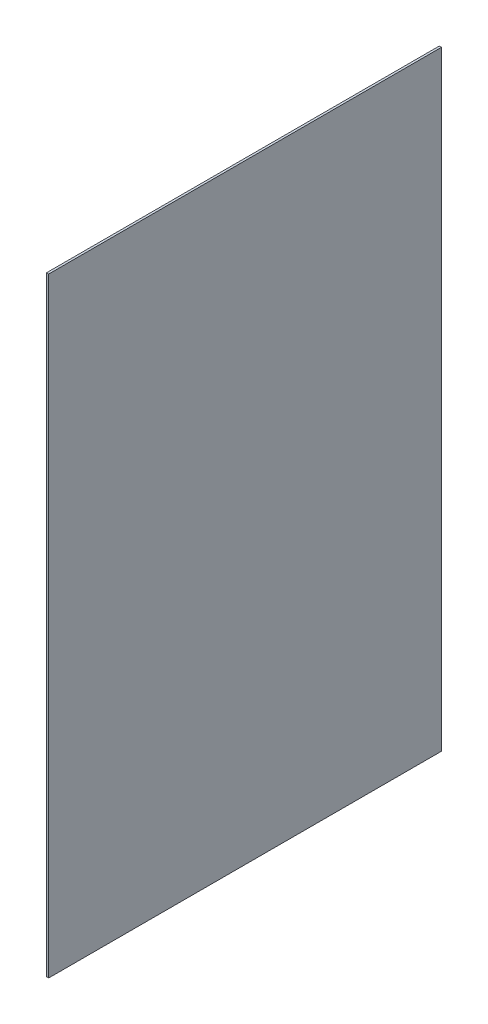
ISO-10303-21;
HEADER;
FILE_DESCRIPTION(('STEP AP214'),'2;1');
FILE_NAME('part.step','',(''),(''),'','','');
FILE_SCHEMA(('AUTOMOTIVE_DESIGN { 1 0 10303 214 1 1 1 1 }'));
ENDSEC;
DATA;
#1=APPLICATION_CONTEXT('core data for automotive mechanical design processes');
#2=APPLICATION_PROTOCOL_DEFINITION('international standard','automotive_design',2000,#1);
#3=PRODUCT_CONTEXT('',#1,'mechanical');
#4=PRODUCT('Part','Part','',(#3));
#5=PRODUCT_RELATED_PRODUCT_CATEGORY('part','',(#4));
#6=PRODUCT_DEFINITION_FORMATION('','',#4);
#7=PRODUCT_DEFINITION_CONTEXT('part definition',#1,'design');
#8=PRODUCT_DEFINITION('design','',#6,#7);
#9=PRODUCT_DEFINITION_SHAPE('','',#8);
#10=(LENGTH_UNIT() NAMED_UNIT(*) SI_UNIT(.MILLI.,.METRE.));
#11=(NAMED_UNIT(*) PLANE_ANGLE_UNIT() SI_UNIT($,.RADIAN.));
#12=(NAMED_UNIT(*) SI_UNIT($,.STERADIAN.) SOLID_ANGLE_UNIT());
#13=UNCERTAINTY_MEASURE_WITH_UNIT(LENGTH_MEASURE(1.E-05),#10,'distance_accuracy_value','');
#14=(GEOMETRIC_REPRESENTATION_CONTEXT(3) GLOBAL_UNCERTAINTY_ASSIGNED_CONTEXT((#13)) GLOBAL_UNIT_ASSIGNED_CONTEXT((#10,
#11,#12)) REPRESENTATION_CONTEXT('',''));
#15=CARTESIAN_POINT('',(0.,0.,0.));
#16=DIRECTION('',(0.,0.,1.));
#17=DIRECTION('',(1.,0.,0.));
#18=AXIS2_PLACEMENT_3D('',#15,#16,#17);
#19=CARTESIAN_POINT('',(-0.005013960000014,1.397,0.));
#20=DIRECTION('',(1.,0.,0.));
#21=DIRECTION('',(0.,0.,-1.));
#22=AXIS2_PLACEMENT_3D('',#19,#20,#21);
#23=PLANE('',#22);
#24=DIRECTION('',(0.,0.,1.));
#25=VECTOR('',#24,1.);
#26=CARTESIAN_POINT('',(-0.005013960000014,-1.397,0.));
#27=LINE('',#26,#25);
#28=CARTESIAN_POINT('',(-0.005013960000014,-1.397,0.));
#29=VERTEX_POINT('',#28);
#30=CARTESIAN_POINT('',(-0.005013960000014,-1.397,1.8));
#31=VERTEX_POINT('',#30);
#32=EDGE_CURVE('E20',#29,#31,#27,.T.);
#33=ORIENTED_EDGE('',*,*,#32,.T.);
#34=DIRECTION('',(0.,1.,0.));
#35=VECTOR('',#34,1.);
#36=CARTESIAN_POINT('',(-0.005013960000014,-1.397,1.8));
#37=LINE('',#36,#35);
#38=CARTESIAN_POINT('',(-0.005013960000014,1.397,1.8));
#39=VERTEX_POINT('',#38);
#40=EDGE_CURVE('E55',#31,#39,#37,.T.);
#41=ORIENTED_EDGE('',*,*,#40,.T.);
#42=DIRECTION('',(0.,0.,-1.));
#43=VECTOR('',#42,1.);
#44=CARTESIAN_POINT('',(-0.005013960000014,1.397,0.));
#45=LINE('',#44,#43);
#46=CARTESIAN_POINT('',(-0.005013960000014,1.397,0.));
#47=VERTEX_POINT('',#46);
#48=EDGE_CURVE('E74',#39,#47,#45,.T.);
#49=ORIENTED_EDGE('',*,*,#48,.T.);
#50=DIRECTION('',(0.,1.,0.));
#51=VECTOR('',#50,1.);
#52=CARTESIAN_POINT('',(-0.005013960000014,-1.397,0.));
#53=LINE('',#52,#51);
#54=EDGE_CURVE('E66',#29,#47,#53,.T.);
#55=ORIENTED_EDGE('',*,*,#54,.F.);
#56=EDGE_LOOP('',(#33,#41,#49,#55));
#57=FACE_BOUND('',#56,.T.);
#58=ADVANCED_FACE('F17',(#57),#23,.F.);
#59=CARTESIAN_POINT('',(-0.005013960000014,-1.397,0.));
#60=DIRECTION('',(0.,1.,0.));
#61=DIRECTION('',(0.,0.,1.));
#62=AXIS2_PLACEMENT_3D('',#59,#60,#61);
#63=PLANE('',#62);
#64=DIRECTION('',(0.,0.,1.));
#65=VECTOR('',#64,1.);
#66=CARTESIAN_POINT('',(0.005016499999982,-1.397,0.));
#67=LINE('',#66,#65);
#68=CARTESIAN_POINT('',(0.005016499999982,-1.397,0.));
#69=VERTEX_POINT('',#68);
#70=CARTESIAN_POINT('',(0.005016499999982,-1.397,1.8));
#71=VERTEX_POINT('',#70);
#72=EDGE_CURVE('E72',#69,#71,#67,.T.);
#73=ORIENTED_EDGE('',*,*,#72,.T.);
#74=DIRECTION('',(-1.,0.,0.));
#75=VECTOR('',#74,1.);
#76=CARTESIAN_POINT('',(-0.005013960000014,-1.397,1.8));
#77=LINE('',#76,#75);
#78=EDGE_CURVE('E62',#71,#31,#77,.T.);
#79=ORIENTED_EDGE('',*,*,#78,.T.);
#80=ORIENTED_EDGE('',*,*,#32,.F.);
#81=DIRECTION('',(-1.,0.,0.));
#82=VECTOR('',#81,1.);
#83=CARTESIAN_POINT('',(-0.005013960000014,-1.397,0.));
#84=LINE('',#83,#82);
#85=EDGE_CURVE('E80',#69,#29,#84,.T.);
#86=ORIENTED_EDGE('',*,*,#85,.F.);
#87=EDGE_LOOP('',(#73,#79,#80,#86));
#88=FACE_BOUND('',#87,.T.);
#89=ADVANCED_FACE('F71',(#88),#63,.F.);
#90=CARTESIAN_POINT('',(-0.005013960000014,-1.397,1.8));
#91=DIRECTION('',(0.,0.,-1.));
#92=DIRECTION('',(-1.,0.,0.));
#93=AXIS2_PLACEMENT_3D('',#90,#91,#92);
#94=PLANE('',#93);
#95=DIRECTION('',(0.,1.,0.));
#96=VECTOR('',#95,1.);
#97=CARTESIAN_POINT('',(0.005016499999982,-1.397,1.8));
#98=LINE('',#97,#96);
#99=CARTESIAN_POINT('',(0.005016499999982,1.397,1.8));
#100=VERTEX_POINT('',#99);
#101=EDGE_CURVE('E83',#71,#100,#98,.T.);
#102=ORIENTED_EDGE('',*,*,#101,.T.);
#103=DIRECTION('',(1.,0.,0.));
#104=VECTOR('',#103,1.);
#105=CARTESIAN_POINT('',(0.005016499999982,1.397,1.8));
#106=LINE('',#105,#104);
#107=EDGE_CURVE('E64',#100,#39,#106,.F.);
#108=ORIENTED_EDGE('',*,*,#107,.T.);
#109=ORIENTED_EDGE('',*,*,#40,.F.);
#110=ORIENTED_EDGE('',*,*,#78,.F.);
#111=EDGE_LOOP('',(#102,#108,#109,#110));
#112=FACE_BOUND('',#111,.T.);
#113=ADVANCED_FACE('F60',(#112),#94,.F.);
#114=CARTESIAN_POINT('',(0.005016499999982,1.397,0.));
#115=DIRECTION('',(0.,-1.,0.));
#116=DIRECTION('',(0.,0.,-1.));
#117=AXIS2_PLACEMENT_3D('',#114,#115,#116);
#118=PLANE('',#117);
#119=ORIENTED_EDGE('',*,*,#48,.F.);
#120=ORIENTED_EDGE('',*,*,#107,.F.);
#121=DIRECTION('',(0.,0.,1.));
#122=VECTOR('',#121,1.);
#123=CARTESIAN_POINT('',(0.005016499999982,1.397,0.));
#124=LINE('',#123,#122);
#125=CARTESIAN_POINT('',(0.005016499999982,1.397,0.));
#126=VERTEX_POINT('',#125);
#127=EDGE_CURVE('E26',#100,#126,#124,.F.);
#128=ORIENTED_EDGE('',*,*,#127,.T.);
#129=DIRECTION('',(-1.,0.,0.));
#130=VECTOR('',#129,1.);
#131=CARTESIAN_POINT('',(-0.005013960000014,1.397,0.));
#132=LINE('',#131,#130);
#133=EDGE_CURVE('E34',#47,#126,#132,.F.);
#134=ORIENTED_EDGE('',*,*,#133,.F.);
#135=EDGE_LOOP('',(#119,#120,#128,#134));
#136=FACE_BOUND('',#135,.T.);
#137=ADVANCED_FACE('F88',(#136),#118,.F.);
#138=CARTESIAN_POINT('',(-0.005013960000014,-1.397,0.));
#139=DIRECTION('',(0.,0.,-1.));
#140=DIRECTION('',(-1.,0.,0.));
#141=AXIS2_PLACEMENT_3D('',#138,#139,#140);
#142=PLANE('',#141);
#143=DIRECTION('',(0.,1.,0.));
#144=VECTOR('',#143,1.);
#145=CARTESIAN_POINT('',(0.005016499999982,-1.397,0.));
#146=LINE('',#145,#144);
#147=EDGE_CURVE('E11',#126,#69,#146,.F.);
#148=ORIENTED_EDGE('',*,*,#147,.T.);
#149=ORIENTED_EDGE('',*,*,#85,.T.);
#150=ORIENTED_EDGE('',*,*,#54,.T.);
#151=ORIENTED_EDGE('',*,*,#133,.T.);
#152=EDGE_LOOP('',(#148,#149,#150,#151));
#153=FACE_BOUND('',#152,.T.);
#154=ADVANCED_FACE('F91',(#153),#142,.T.);
#155=CARTESIAN_POINT('',(0.005016499999982,-1.397,0.));
#156=DIRECTION('',(-1.,0.,0.));
#157=DIRECTION('',(0.,0.,1.));
#158=AXIS2_PLACEMENT_3D('',#155,#156,#157);
#159=PLANE('',#158);
#160=ORIENTED_EDGE('',*,*,#127,.F.);
#161=ORIENTED_EDGE('',*,*,#101,.F.);
#162=ORIENTED_EDGE('',*,*,#72,.F.);
#163=ORIENTED_EDGE('',*,*,#147,.F.);
#164=EDGE_LOOP('',(#160,#161,#162,#163));
#165=FACE_BOUND('',#164,.T.);
#166=ADVANCED_FACE('F90',(#165),#159,.F.);
#167=CLOSED_SHELL('',(#58,#89,#113,#137,#154,#166));
#168=MANIFOLD_SOLID_BREP('B1',#167);
#169=ADVANCED_BREP_SHAPE_REPRESENTATION('',(#18,#168),#14);
#170=SHAPE_DEFINITION_REPRESENTATION(#9,#169);
ENDSEC;
END-ISO-10303-21;
